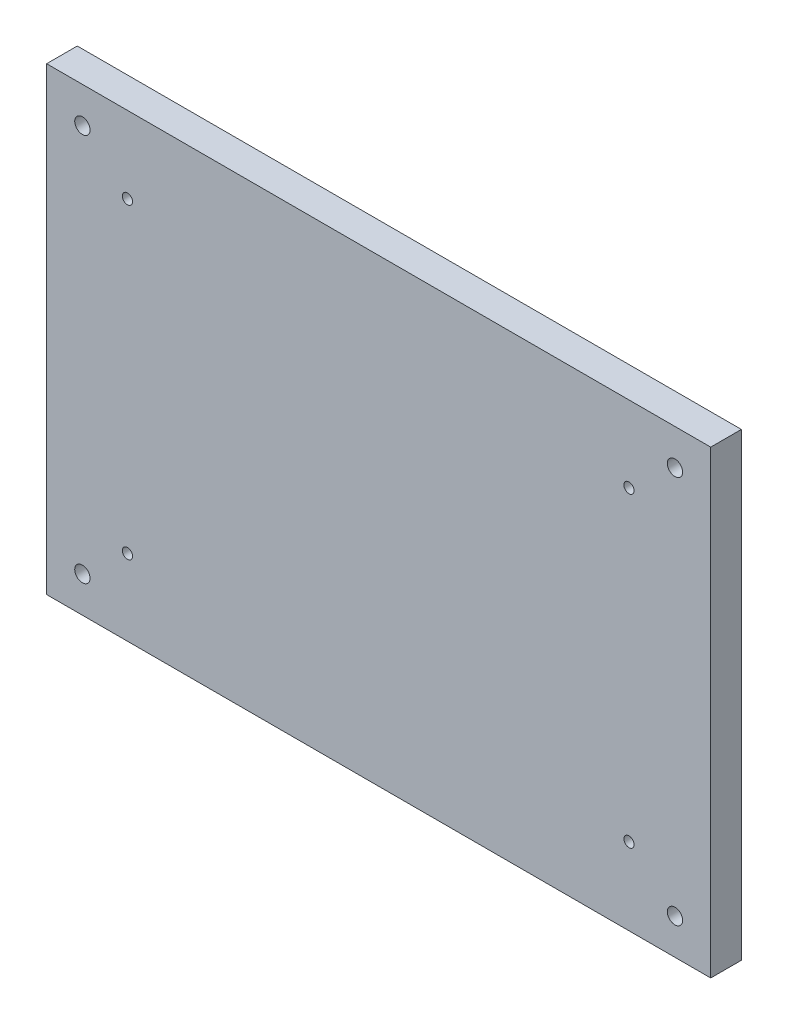
ISO-10303-21;
HEADER;
FILE_DESCRIPTION(('STEP AP214'),'2;1');
FILE_NAME('part.step','',(''),(''),'','','');
FILE_SCHEMA(('AUTOMOTIVE_DESIGN { 1 0 10303 214 1 1 1 1 }'));
ENDSEC;
DATA;
#1=APPLICATION_CONTEXT('core data for automotive mechanical design processes');
#2=APPLICATION_PROTOCOL_DEFINITION('international standard','automotive_design',2000,#1);
#3=PRODUCT_CONTEXT('',#1,'mechanical');
#4=PRODUCT('Part','Part','',(#3));
#5=PRODUCT_RELATED_PRODUCT_CATEGORY('part','',(#4));
#6=PRODUCT_DEFINITION_FORMATION('','',#4);
#7=PRODUCT_DEFINITION_CONTEXT('part definition',#1,'design');
#8=PRODUCT_DEFINITION('design','',#6,#7);
#9=PRODUCT_DEFINITION_SHAPE('','',#8);
#10=(LENGTH_UNIT() NAMED_UNIT(*) SI_UNIT(.MILLI.,.METRE.));
#11=(NAMED_UNIT(*) PLANE_ANGLE_UNIT() SI_UNIT($,.RADIAN.));
#12=(NAMED_UNIT(*) SI_UNIT($,.STERADIAN.) SOLID_ANGLE_UNIT());
#13=UNCERTAINTY_MEASURE_WITH_UNIT(LENGTH_MEASURE(1.E-05),#10,'distance_accuracy_value','');
#14=(GEOMETRIC_REPRESENTATION_CONTEXT(3) GLOBAL_UNCERTAINTY_ASSIGNED_CONTEXT((#13)) GLOBAL_UNIT_ASSIGNED_CONTEXT((#10,
#11,#12)) REPRESENTATION_CONTEXT('',''));
#15=CARTESIAN_POINT('',(0.,0.,0.));
#16=DIRECTION('',(0.,0.,1.));
#17=DIRECTION('',(1.,0.,0.));
#18=AXIS2_PLACEMENT_3D('',#15,#16,#17);
#19=CARTESIAN_POINT('',(0.,0.,6.));
#20=DIRECTION('',(1.,0.,0.));
#21=DIRECTION('',(0.,0.,-1.));
#22=AXIS2_PLACEMENT_3D('',#19,#20,#21);
#23=PLANE('',#22);
#24=DIRECTION('',(0.,-1.,0.));
#25=VECTOR('',#24,1.);
#26=CARTESIAN_POINT('',(0.,0.,0.));
#27=LINE('',#26,#25);
#28=CARTESIAN_POINT('',(0.,90.,0.));
#29=VERTEX_POINT('',#28);
#30=CARTESIAN_POINT('',(0.,0.,0.));
#31=VERTEX_POINT('',#30);
#32=EDGE_CURVE('E107',#29,#31,#27,.T.);
#33=ORIENTED_EDGE('',*,*,#32,.T.);
#34=DIRECTION('',(0.,0.,-1.));
#35=VECTOR('',#34,1.);
#36=CARTESIAN_POINT('',(0.,0.,6.));
#37=LINE('',#36,#35);
#38=CARTESIAN_POINT('',(0.,0.,6.));
#39=VERTEX_POINT('',#38);
#40=EDGE_CURVE('E11',#39,#31,#37,.T.);
#41=ORIENTED_EDGE('',*,*,#40,.F.);
#42=DIRECTION('',(0.,-1.,0.));
#43=VECTOR('',#42,1.);
#44=CARTESIAN_POINT('',(0.,0.,6.));
#45=LINE('',#44,#43);
#46=CARTESIAN_POINT('',(0.,90.,6.));
#47=VERTEX_POINT('',#46);
#48=EDGE_CURVE('E91',#47,#39,#45,.T.);
#49=ORIENTED_EDGE('',*,*,#48,.F.);
#50=DIRECTION('',(0.,0.,-1.));
#51=VECTOR('',#50,1.);
#52=CARTESIAN_POINT('',(0.,90.,6.));
#53=LINE('',#52,#51);
#54=EDGE_CURVE('E103',#47,#29,#53,.T.);
#55=ORIENTED_EDGE('',*,*,#54,.T.);
#56=EDGE_LOOP('',(#33,#41,#49,#55));
#57=FACE_BOUND('',#56,.T.);
#58=ADVANCED_FACE('F39',(#57),#23,.F.);
#59=CARTESIAN_POINT('',(0.,0.,6.));
#60=DIRECTION('',(0.,1.,0.));
#61=DIRECTION('',(0.,0.,1.));
#62=AXIS2_PLACEMENT_3D('',#59,#60,#61);
#63=PLANE('',#62);
#64=DIRECTION('',(1.,0.,0.));
#65=VECTOR('',#64,1.);
#66=CARTESIAN_POINT('',(0.,0.,0.));
#67=LINE('',#66,#65);
#68=CARTESIAN_POINT('',(130.,0.,0.));
#69=VERTEX_POINT('',#68);
#70=EDGE_CURVE('E96',#31,#69,#67,.T.);
#71=ORIENTED_EDGE('',*,*,#70,.T.);
#72=DIRECTION('',(0.,0.,-1.));
#73=VECTOR('',#72,1.);
#74=CARTESIAN_POINT('',(130.,0.,6.));
#75=LINE('',#74,#73);
#76=CARTESIAN_POINT('',(130.,0.,6.));
#77=VERTEX_POINT('',#76);
#78=EDGE_CURVE('E48',#77,#69,#75,.T.);
#79=ORIENTED_EDGE('',*,*,#78,.F.);
#80=DIRECTION('',(1.,0.,0.));
#81=VECTOR('',#80,1.);
#82=CARTESIAN_POINT('',(0.,0.,6.));
#83=LINE('',#82,#81);
#84=EDGE_CURVE('E86',#39,#77,#83,.T.);
#85=ORIENTED_EDGE('',*,*,#84,.F.);
#86=ORIENTED_EDGE('',*,*,#40,.T.);
#87=EDGE_LOOP('',(#71,#79,#85,#86));
#88=FACE_BOUND('',#87,.T.);
#89=ADVANCED_FACE('F95',(#88),#63,.F.);
#90=CARTESIAN_POINT('',(130.,0.,6.));
#91=DIRECTION('',(-1.,0.,0.));
#92=DIRECTION('',(0.,0.,1.));
#93=AXIS2_PLACEMENT_3D('',#90,#91,#92);
#94=PLANE('',#93);
#95=DIRECTION('',(0.,1.,0.));
#96=VECTOR('',#95,1.);
#97=CARTESIAN_POINT('',(130.,0.,0.));
#98=LINE('',#97,#96);
#99=CARTESIAN_POINT('',(130.,90.,0.));
#100=VERTEX_POINT('',#99);
#101=EDGE_CURVE('E73',#69,#100,#98,.T.);
#102=ORIENTED_EDGE('',*,*,#101,.T.);
#103=DIRECTION('',(0.,0.,-1.));
#104=VECTOR('',#103,1.);
#105=CARTESIAN_POINT('',(130.,90.,6.));
#106=LINE('',#105,#104);
#107=CARTESIAN_POINT('',(130.,90.,6.));
#108=VERTEX_POINT('',#107);
#109=EDGE_CURVE('E98',#108,#100,#106,.T.);
#110=ORIENTED_EDGE('',*,*,#109,.F.);
#111=DIRECTION('',(0.,1.,0.));
#112=VECTOR('',#111,1.);
#113=CARTESIAN_POINT('',(130.,0.,6.));
#114=LINE('',#113,#112);
#115=EDGE_CURVE('E89',#77,#108,#114,.T.);
#116=ORIENTED_EDGE('',*,*,#115,.F.);
#117=ORIENTED_EDGE('',*,*,#78,.T.);
#118=EDGE_LOOP('',(#102,#110,#116,#117));
#119=FACE_BOUND('',#118,.T.);
#120=ADVANCED_FACE('F99',(#119),#94,.F.);
#121=CARTESIAN_POINT('',(0.,90.,6.));
#122=DIRECTION('',(0.,-1.,0.));
#123=DIRECTION('',(0.,0.,-1.));
#124=AXIS2_PLACEMENT_3D('',#121,#122,#123);
#125=PLANE('',#124);
#126=DIRECTION('',(-1.,0.,0.));
#127=VECTOR('',#126,1.);
#128=CARTESIAN_POINT('',(0.,90.,0.));
#129=LINE('',#128,#127);
#130=EDGE_CURVE('E79',#100,#29,#129,.T.);
#131=ORIENTED_EDGE('',*,*,#130,.T.);
#132=ORIENTED_EDGE('',*,*,#54,.F.);
#133=DIRECTION('',(-1.,0.,0.));
#134=VECTOR('',#133,1.);
#135=CARTESIAN_POINT('',(0.,90.,6.));
#136=LINE('',#135,#134);
#137=EDGE_CURVE('E56',#108,#47,#136,.T.);
#138=ORIENTED_EDGE('',*,*,#137,.F.);
#139=ORIENTED_EDGE('',*,*,#109,.T.);
#140=EDGE_LOOP('',(#131,#132,#138,#139));
#141=FACE_BOUND('',#140,.T.);
#142=ADVANCED_FACE('F121',(#141),#125,.F.);
#143=CARTESIAN_POINT('',(0.,0.,6.));
#144=DIRECTION('',(0.,0.,-1.));
#145=DIRECTION('',(-1.,0.,0.));
#146=AXIS2_PLACEMENT_3D('',#143,#144,#145);
#147=PLANE('',#146);
#148=CARTESIAN_POINT('',(114.,75.1,6.));
#149=DIRECTION('',(0.,0.,-1.));
#150=DIRECTION('',(-1.,0.,0.));
#151=AXIS2_PLACEMENT_3D('',#148,#149,#150);
#152=CIRCLE('',#151,1.);
#153=CARTESIAN_POINT('',(113.,75.1,6.));
#154=VERTEX_POINT('',#153);
#155=EDGE_CURVE('E183',#154,#154,#152,.T.);
#156=ORIENTED_EDGE('',*,*,#155,.T.);
#157=EDGE_LOOP('',(#156));
#158=FACE_BOUND('',#157,.T.);
#159=CARTESIAN_POINT('',(114.,15.1,6.));
#160=DIRECTION('',(0.,0.,-1.));
#161=DIRECTION('',(-1.,0.,0.));
#162=AXIS2_PLACEMENT_3D('',#159,#160,#161);
#163=CIRCLE('',#162,1.);
#164=CARTESIAN_POINT('',(113.,15.1,6.));
#165=VERTEX_POINT('',#164);
#166=EDGE_CURVE('E175',#165,#165,#163,.T.);
#167=ORIENTED_EDGE('',*,*,#166,.T.);
#168=EDGE_LOOP('',(#167));
#169=FACE_BOUND('',#168,.T.);
#170=CARTESIAN_POINT('',(15.82,14.89,6.));
#171=DIRECTION('',(0.,0.,-1.));
#172=DIRECTION('',(-1.,0.,0.));
#173=AXIS2_PLACEMENT_3D('',#170,#171,#172);
#174=CIRCLE('',#173,0.999999999999999);
#175=CARTESIAN_POINT('',(14.82,14.89,6.));
#176=VERTEX_POINT('',#175);
#177=EDGE_CURVE('E167',#176,#176,#174,.T.);
#178=ORIENTED_EDGE('',*,*,#177,.T.);
#179=EDGE_LOOP('',(#178));
#180=FACE_BOUND('',#179,.T.);
#181=CARTESIAN_POINT('',(15.82,75.,6.));
#182=DIRECTION('',(0.,0.,-1.));
#183=DIRECTION('',(-1.,0.,0.));
#184=AXIS2_PLACEMENT_3D('',#181,#182,#183);
#185=CIRCLE('',#184,0.999999999999999);
#186=CARTESIAN_POINT('',(14.82,75.,6.));
#187=VERTEX_POINT('',#186);
#188=EDGE_CURVE('E159',#187,#187,#185,.T.);
#189=ORIENTED_EDGE('',*,*,#188,.T.);
#190=EDGE_LOOP('',(#189));
#191=FACE_BOUND('',#190,.T.);
#192=CARTESIAN_POINT('',(123.,83.,6.));
#193=DIRECTION('',(0.,0.,1.));
#194=DIRECTION('',(1.,0.,0.));
#195=AXIS2_PLACEMENT_3D('',#192,#193,#194);
#196=CIRCLE('',#195,1.49999999999999);
#197=CARTESIAN_POINT('',(124.5,83.,6.));
#198=VERTEX_POINT('',#197);
#199=EDGE_CURVE('E155',#198,#198,#196,.T.);
#200=ORIENTED_EDGE('',*,*,#199,.F.);
#201=EDGE_LOOP('',(#200));
#202=FACE_BOUND('',#201,.T.);
#203=CARTESIAN_POINT('',(123.,6.99999999999998,6.));
#204=DIRECTION('',(0.,0.,1.));
#205=DIRECTION('',(1.,0.,0.));
#206=AXIS2_PLACEMENT_3D('',#203,#204,#205);
#207=CIRCLE('',#206,1.49999999999999);
#208=CARTESIAN_POINT('',(124.5,6.99999999999998,6.));
#209=VERTEX_POINT('',#208);
#210=EDGE_CURVE('E147',#209,#209,#207,.T.);
#211=ORIENTED_EDGE('',*,*,#210,.F.);
#212=EDGE_LOOP('',(#211));
#213=FACE_BOUND('',#212,.T.);
#214=CARTESIAN_POINT('',(6.99999999999999,6.99999999999999,6.));
#215=DIRECTION('',(0.,0.,1.));
#216=DIRECTION('',(1.,0.,0.));
#217=AXIS2_PLACEMENT_3D('',#214,#215,#216);
#218=CIRCLE('',#217,1.49999999999999);
#219=CARTESIAN_POINT('',(8.49999999999998,6.99999999999999,6.));
#220=VERTEX_POINT('',#219);
#221=EDGE_CURVE('E139',#220,#220,#218,.T.);
#222=ORIENTED_EDGE('',*,*,#221,.F.);
#223=EDGE_LOOP('',(#222));
#224=FACE_BOUND('',#223,.T.);
#225=CARTESIAN_POINT('',(6.99999999999999,83.,6.));
#226=DIRECTION('',(0.,0.,1.));
#227=DIRECTION('',(1.,0.,0.));
#228=AXIS2_PLACEMENT_3D('',#225,#226,#227);
#229=CIRCLE('',#228,1.49999999999999);
#230=CARTESIAN_POINT('',(8.49999999999998,83.,6.));
#231=VERTEX_POINT('',#230);
#232=EDGE_CURVE('E131',#231,#231,#229,.T.);
#233=ORIENTED_EDGE('',*,*,#232,.F.);
#234=EDGE_LOOP('',(#233));
#235=FACE_BOUND('',#234,.T.);
#236=ORIENTED_EDGE('',*,*,#48,.T.);
#237=ORIENTED_EDGE('',*,*,#84,.T.);
#238=ORIENTED_EDGE('',*,*,#115,.T.);
#239=ORIENTED_EDGE('',*,*,#137,.T.);
#240=EDGE_LOOP('',(#236,#237,#238,#239));
#241=FACE_BOUND('',#240,.T.);
#242=ADVANCED_FACE('F87',(#158,#169,#180,#191,#202,#213,#224,#235,#241),#147,.F.);
#243=CARTESIAN_POINT('',(0.,0.,0.));
#244=DIRECTION('',(0.,0.,-1.));
#245=DIRECTION('',(-1.,0.,0.));
#246=AXIS2_PLACEMENT_3D('',#243,#244,#245);
#247=PLANE('',#246);
#248=CARTESIAN_POINT('',(114.,75.1,0.));
#249=DIRECTION('',(0.,0.,-1.));
#250=DIRECTION('',(-1.,0.,0.));
#251=AXIS2_PLACEMENT_3D('',#248,#249,#250);
#252=CIRCLE('',#251,1.);
#253=CARTESIAN_POINT('',(113.,75.1,0.));
#254=VERTEX_POINT('',#253);
#255=EDGE_CURVE('E187',#254,#254,#252,.T.);
#256=ORIENTED_EDGE('',*,*,#255,.F.);
#257=EDGE_LOOP('',(#256));
#258=FACE_BOUND('',#257,.T.);
#259=CARTESIAN_POINT('',(114.,15.1,0.));
#260=DIRECTION('',(0.,0.,-1.));
#261=DIRECTION('',(-1.,0.,0.));
#262=AXIS2_PLACEMENT_3D('',#259,#260,#261);
#263=CIRCLE('',#262,1.);
#264=CARTESIAN_POINT('',(113.,15.1,0.));
#265=VERTEX_POINT('',#264);
#266=EDGE_CURVE('E179',#265,#265,#263,.T.);
#267=ORIENTED_EDGE('',*,*,#266,.F.);
#268=EDGE_LOOP('',(#267));
#269=FACE_BOUND('',#268,.T.);
#270=CARTESIAN_POINT('',(15.82,14.89,0.));
#271=DIRECTION('',(0.,0.,-1.));
#272=DIRECTION('',(-1.,0.,0.));
#273=AXIS2_PLACEMENT_3D('',#270,#271,#272);
#274=CIRCLE('',#273,1.);
#275=CARTESIAN_POINT('',(14.82,14.89,0.));
#276=VERTEX_POINT('',#275);
#277=EDGE_CURVE('E171',#276,#276,#274,.T.);
#278=ORIENTED_EDGE('',*,*,#277,.F.);
#279=EDGE_LOOP('',(#278));
#280=FACE_BOUND('',#279,.T.);
#281=CARTESIAN_POINT('',(15.82,75.,0.));
#282=DIRECTION('',(0.,0.,-1.));
#283=DIRECTION('',(-1.,0.,0.));
#284=AXIS2_PLACEMENT_3D('',#281,#282,#283);
#285=CIRCLE('',#284,1.);
#286=CARTESIAN_POINT('',(14.82,75.,0.));
#287=VERTEX_POINT('',#286);
#288=EDGE_CURVE('E163',#287,#287,#285,.T.);
#289=ORIENTED_EDGE('',*,*,#288,.F.);
#290=EDGE_LOOP('',(#289));
#291=FACE_BOUND('',#290,.T.);
#292=CARTESIAN_POINT('',(123.,83.,0.));
#293=DIRECTION('',(0.,0.,-1.));
#294=DIRECTION('',(-1.,0.,0.));
#295=AXIS2_PLACEMENT_3D('',#292,#293,#294);
#296=CIRCLE('',#295,1.49999999999999);
#297=CARTESIAN_POINT('',(121.5,83.,0.));
#298=VERTEX_POINT('',#297);
#299=EDGE_CURVE('E151',#298,#298,#296,.T.);
#300=ORIENTED_EDGE('',*,*,#299,.F.);
#301=EDGE_LOOP('',(#300));
#302=FACE_BOUND('',#301,.T.);
#303=CARTESIAN_POINT('',(123.,6.99999999999998,0.));
#304=DIRECTION('',(0.,0.,-1.));
#305=DIRECTION('',(-1.,0.,0.));
#306=AXIS2_PLACEMENT_3D('',#303,#304,#305);
#307=CIRCLE('',#306,1.49999999999999);
#308=CARTESIAN_POINT('',(121.5,6.99999999999998,0.));
#309=VERTEX_POINT('',#308);
#310=EDGE_CURVE('E143',#309,#309,#307,.T.);
#311=ORIENTED_EDGE('',*,*,#310,.F.);
#312=EDGE_LOOP('',(#311));
#313=FACE_BOUND('',#312,.T.);
#314=CARTESIAN_POINT('',(6.99999999999999,6.99999999999999,0.));
#315=DIRECTION('',(0.,0.,-1.));
#316=DIRECTION('',(-1.,0.,0.));
#317=AXIS2_PLACEMENT_3D('',#314,#315,#316);
#318=CIRCLE('',#317,1.49999999999999);
#319=CARTESIAN_POINT('',(5.5,6.99999999999999,0.));
#320=VERTEX_POINT('',#319);
#321=EDGE_CURVE('E135',#320,#320,#318,.T.);
#322=ORIENTED_EDGE('',*,*,#321,.F.);
#323=EDGE_LOOP('',(#322));
#324=FACE_BOUND('',#323,.T.);
#325=CARTESIAN_POINT('',(6.99999999999999,83.,0.));
#326=DIRECTION('',(0.,0.,-1.));
#327=DIRECTION('',(-1.,0.,0.));
#328=AXIS2_PLACEMENT_3D('',#325,#326,#327);
#329=CIRCLE('',#328,1.49999999999999);
#330=CARTESIAN_POINT('',(5.5,83.,0.));
#331=VERTEX_POINT('',#330);
#332=EDGE_CURVE('E111',#331,#331,#329,.T.);
#333=ORIENTED_EDGE('',*,*,#332,.F.);
#334=EDGE_LOOP('',(#333));
#335=FACE_BOUND('',#334,.T.);
#336=ORIENTED_EDGE('',*,*,#32,.F.);
#337=ORIENTED_EDGE('',*,*,#130,.F.);
#338=ORIENTED_EDGE('',*,*,#101,.F.);
#339=ORIENTED_EDGE('',*,*,#70,.F.);
#340=EDGE_LOOP('',(#336,#337,#338,#339));
#341=FACE_BOUND('',#340,.T.);
#342=ADVANCED_FACE('F124',(#258,#269,#280,#291,#302,#313,#324,#335,#341),#247,.T.);
#343=CARTESIAN_POINT('',(6.99999999999999,83.,6.));
#344=DIRECTION('',(0.,0.,1.));
#345=DIRECTION('',(1.,0.,0.));
#346=AXIS2_PLACEMENT_3D('',#343,#344,#345);
#347=CYLINDRICAL_SURFACE('',#346,1.49999999999999);
#348=ORIENTED_EDGE('',*,*,#232,.T.);
#349=EDGE_LOOP('',(#348));
#350=FACE_BOUND('',#349,.T.);
#351=ORIENTED_EDGE('',*,*,#332,.T.);
#352=EDGE_LOOP('',(#351));
#353=FACE_BOUND('',#352,.T.);
#354=ADVANCED_FACE('F196',(#350,#353),#347,.F.);
#355=CARTESIAN_POINT('',(6.99999999999999,6.99999999999999,6.));
#356=DIRECTION('',(0.,0.,1.));
#357=DIRECTION('',(1.,0.,0.));
#358=AXIS2_PLACEMENT_3D('',#355,#356,#357);
#359=CYLINDRICAL_SURFACE('',#358,1.49999999999999);
#360=ORIENTED_EDGE('',*,*,#221,.T.);
#361=EDGE_LOOP('',(#360));
#362=FACE_BOUND('',#361,.T.);
#363=ORIENTED_EDGE('',*,*,#321,.T.);
#364=EDGE_LOOP('',(#363));
#365=FACE_BOUND('',#364,.T.);
#366=ADVANCED_FACE('F213',(#362,#365),#359,.F.);
#367=CARTESIAN_POINT('',(123.,6.99999999999998,6.));
#368=DIRECTION('',(0.,0.,1.));
#369=DIRECTION('',(1.,0.,0.));
#370=AXIS2_PLACEMENT_3D('',#367,#368,#369);
#371=CYLINDRICAL_SURFACE('',#370,1.49999999999999);
#372=ORIENTED_EDGE('',*,*,#210,.T.);
#373=EDGE_LOOP('',(#372));
#374=FACE_BOUND('',#373,.T.);
#375=ORIENTED_EDGE('',*,*,#310,.T.);
#376=EDGE_LOOP('',(#375));
#377=FACE_BOUND('',#376,.T.);
#378=ADVANCED_FACE('F219',(#374,#377),#371,.F.);
#379=CARTESIAN_POINT('',(123.,83.,6.));
#380=DIRECTION('',(0.,0.,1.));
#381=DIRECTION('',(1.,0.,0.));
#382=AXIS2_PLACEMENT_3D('',#379,#380,#381);
#383=CYLINDRICAL_SURFACE('',#382,1.49999999999999);
#384=ORIENTED_EDGE('',*,*,#199,.T.);
#385=EDGE_LOOP('',(#384));
#386=FACE_BOUND('',#385,.T.);
#387=ORIENTED_EDGE('',*,*,#299,.T.);
#388=EDGE_LOOP('',(#387));
#389=FACE_BOUND('',#388,.T.);
#390=ADVANCED_FACE('F256',(#386,#389),#383,.F.);
#391=CARTESIAN_POINT('',(15.82,75.,0.));
#392=DIRECTION('',(0.,0.,-1.));
#393=DIRECTION('',(-1.,0.,0.));
#394=AXIS2_PLACEMENT_3D('',#391,#392,#393);
#395=CYLINDRICAL_SURFACE('',#394,0.999999999999999);
#396=ORIENTED_EDGE('',*,*,#188,.F.);
#397=EDGE_LOOP('',(#396));
#398=FACE_BOUND('',#397,.T.);
#399=ORIENTED_EDGE('',*,*,#288,.T.);
#400=EDGE_LOOP('',(#399));
#401=FACE_BOUND('',#400,.T.);
#402=ADVANCED_FACE('F261',(#398,#401),#395,.F.);
#403=CARTESIAN_POINT('',(15.82,14.89,0.));
#404=DIRECTION('',(0.,0.,-1.));
#405=DIRECTION('',(-1.,0.,0.));
#406=AXIS2_PLACEMENT_3D('',#403,#404,#405);
#407=CYLINDRICAL_SURFACE('',#406,0.999999999999999);
#408=ORIENTED_EDGE('',*,*,#177,.F.);
#409=EDGE_LOOP('',(#408));
#410=FACE_BOUND('',#409,.T.);
#411=ORIENTED_EDGE('',*,*,#277,.T.);
#412=EDGE_LOOP('',(#411));
#413=FACE_BOUND('',#412,.T.);
#414=ADVANCED_FACE('F267',(#410,#413),#407,.F.);
#415=CARTESIAN_POINT('',(114.,15.1,0.));
#416=DIRECTION('',(0.,0.,-1.));
#417=DIRECTION('',(-1.,0.,0.));
#418=AXIS2_PLACEMENT_3D('',#415,#416,#417);
#419=CYLINDRICAL_SURFACE('',#418,1.);
#420=ORIENTED_EDGE('',*,*,#166,.F.);
#421=EDGE_LOOP('',(#420));
#422=FACE_BOUND('',#421,.T.);
#423=ORIENTED_EDGE('',*,*,#266,.T.);
#424=EDGE_LOOP('',(#423));
#425=FACE_BOUND('',#424,.T.);
#426=ADVANCED_FACE('F271',(#422,#425),#419,.F.);
#427=CARTESIAN_POINT('',(114.,75.1,0.));
#428=DIRECTION('',(0.,0.,-1.));
#429=DIRECTION('',(-1.,0.,0.));
#430=AXIS2_PLACEMENT_3D('',#427,#428,#429);
#431=CYLINDRICAL_SURFACE('',#430,1.);
#432=ORIENTED_EDGE('',*,*,#155,.F.);
#433=EDGE_LOOP('',(#432));
#434=FACE_BOUND('',#433,.T.);
#435=ORIENTED_EDGE('',*,*,#255,.T.);
#436=EDGE_LOOP('',(#435));
#437=FACE_BOUND('',#436,.T.);
#438=ADVANCED_FACE('F192',(#434,#437),#431,.F.);
#439=CLOSED_SHELL('',(#58,#89,#120,#142,#242,#342,#354,#366,#378,#390,#402,#414,#426,#438));
#440=MANIFOLD_SOLID_BREP('B2',#439);
#441=ADVANCED_BREP_SHAPE_REPRESENTATION('',(#18,#440),#14);
#442=SHAPE_DEFINITION_REPRESENTATION(#9,#441);
ENDSEC;
END-ISO-10303-21;
